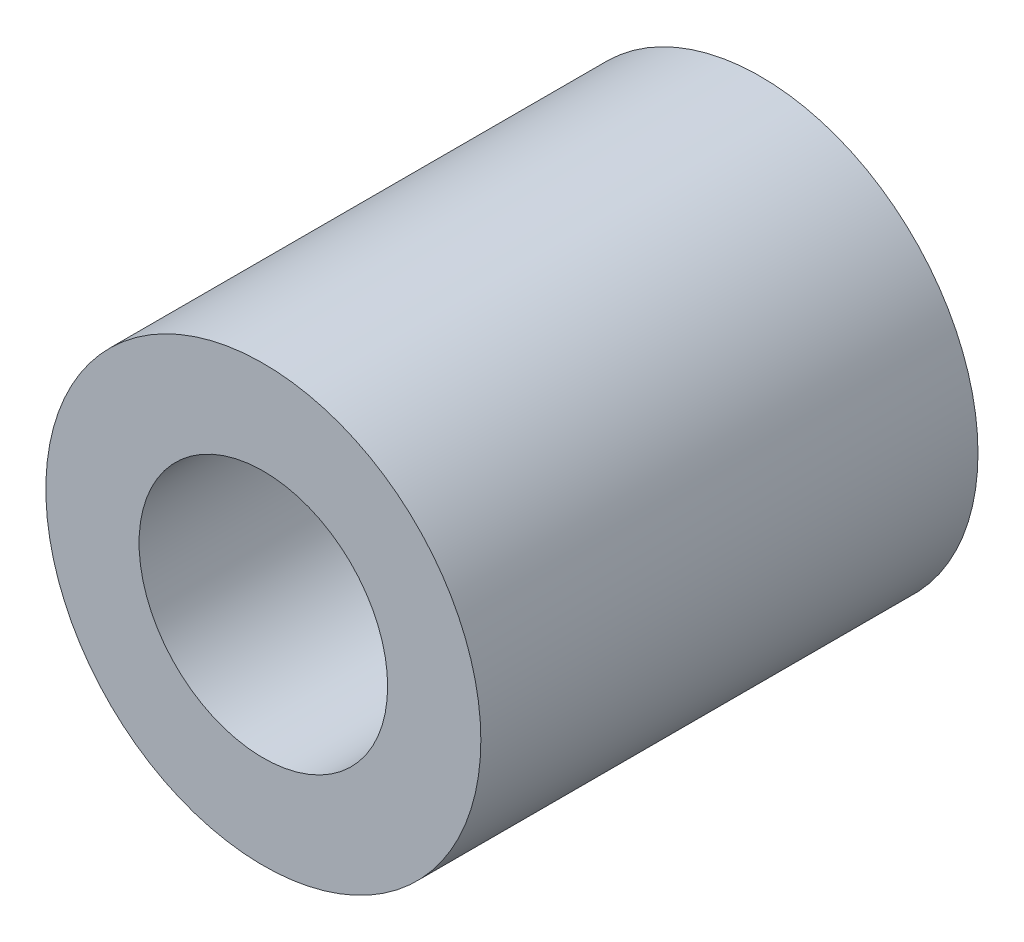
ISO-10303-21;
HEADER;
FILE_DESCRIPTION(('STEP AP214'),'2;1');
FILE_NAME('part.step','',(''),(''),'','','');
FILE_SCHEMA(('AUTOMOTIVE_DESIGN { 1 0 10303 214 1 1 1 1 }'));
ENDSEC;
DATA;
#1=APPLICATION_CONTEXT('core data for automotive mechanical design processes');
#2=APPLICATION_PROTOCOL_DEFINITION('international standard','automotive_design',2000,#1);
#3=PRODUCT_CONTEXT('',#1,'mechanical');
#4=PRODUCT('Part','Part','',(#3));
#5=PRODUCT_RELATED_PRODUCT_CATEGORY('part','',(#4));
#6=PRODUCT_DEFINITION_FORMATION('','',#4);
#7=PRODUCT_DEFINITION_CONTEXT('part definition',#1,'design');
#8=PRODUCT_DEFINITION('design','',#6,#7);
#9=PRODUCT_DEFINITION_SHAPE('','',#8);
#10=(LENGTH_UNIT() NAMED_UNIT(*) SI_UNIT(.MILLI.,.METRE.));
#11=(NAMED_UNIT(*) PLANE_ANGLE_UNIT() SI_UNIT($,.RADIAN.));
#12=(NAMED_UNIT(*) SI_UNIT($,.STERADIAN.) SOLID_ANGLE_UNIT());
#13=UNCERTAINTY_MEASURE_WITH_UNIT(LENGTH_MEASURE(1.E-05),#10,'distance_accuracy_value','');
#14=(GEOMETRIC_REPRESENTATION_CONTEXT(3) GLOBAL_UNCERTAINTY_ASSIGNED_CONTEXT((#13)) GLOBAL_UNIT_ASSIGNED_CONTEXT((#10,
#11,#12)) REPRESENTATION_CONTEXT('',''));
#15=CARTESIAN_POINT('',(0.,0.,0.));
#16=DIRECTION('',(0.,0.,1.));
#17=DIRECTION('',(1.,0.,0.));
#18=AXIS2_PLACEMENT_3D('',#15,#16,#17);
#19=CARTESIAN_POINT('',(3.88578058618805E-13,0.,12.7));
#20=DIRECTION('',(0.,0.,1.));
#21=DIRECTION('',(1.,0.,0.));
#22=AXIS2_PLACEMENT_3D('',#19,#20,#21);
#23=PLANE('',#22);
#24=CARTESIAN_POINT('',(3.88578058618805E-13,0.,12.7));
#25=DIRECTION('',(0.,0.,1.));
#26=DIRECTION('',(1.,0.,0.));
#27=AXIS2_PLACEMENT_3D('',#24,#25,#26);
#28=CIRCLE('',#27,11.1125);
#29=CARTESIAN_POINT('',(11.1125000000004,0.,12.7));
#30=VERTEX_POINT('',#29);
#31=EDGE_CURVE('E10',#30,#30,#28,.T.);
#32=ORIENTED_EDGE('',*,*,#31,.T.);
#33=EDGE_LOOP('',(#32));
#34=FACE_BOUND('',#33,.T.);
#35=CARTESIAN_POINT('',(3.88578058618805E-13,0.,12.7));
#36=DIRECTION('',(0.,0.,1.));
#37=DIRECTION('',(1.,0.,0.));
#38=AXIS2_PLACEMENT_3D('',#35,#36,#37);
#39=CIRCLE('',#38,6.35);
#40=CARTESIAN_POINT('',(6.35000000000039,0.,12.7));
#41=VERTEX_POINT('',#40);
#42=EDGE_CURVE('E39',#41,#41,#39,.T.);
#43=ORIENTED_EDGE('',*,*,#42,.F.);
#44=EDGE_LOOP('',(#43));
#45=FACE_BOUND('',#44,.T.);
#46=ADVANCED_FACE('F28',(#34,#45),#23,.T.);
#47=CARTESIAN_POINT('',(3.88578058618805E-13,0.,-12.7));
#48=DIRECTION('',(0.,0.,1.));
#49=DIRECTION('',(1.,0.,0.));
#50=AXIS2_PLACEMENT_3D('',#47,#48,#49);
#51=PLANE('',#50);
#52=CARTESIAN_POINT('',(3.88578058618805E-13,0.,-12.7));
#53=DIRECTION('',(0.,0.,1.));
#54=DIRECTION('',(1.,0.,0.));
#55=AXIS2_PLACEMENT_3D('',#52,#53,#54);
#56=CIRCLE('',#55,11.1125);
#57=CARTESIAN_POINT('',(11.1125000000004,0.,-12.7));
#58=VERTEX_POINT('',#57);
#59=EDGE_CURVE('E32',#58,#58,#56,.T.);
#60=ORIENTED_EDGE('',*,*,#59,.F.);
#61=EDGE_LOOP('',(#60));
#62=FACE_BOUND('',#61,.T.);
#63=CARTESIAN_POINT('',(3.88578058618805E-13,0.,-12.7));
#64=DIRECTION('',(0.,0.,1.));
#65=DIRECTION('',(1.,0.,0.));
#66=AXIS2_PLACEMENT_3D('',#63,#64,#65);
#67=CIRCLE('',#66,6.35);
#68=CARTESIAN_POINT('',(6.35000000000039,0.,-12.7));
#69=VERTEX_POINT('',#68);
#70=EDGE_CURVE('E41',#69,#69,#67,.T.);
#71=ORIENTED_EDGE('',*,*,#70,.T.);
#72=EDGE_LOOP('',(#71));
#73=FACE_BOUND('',#72,.T.);
#74=ADVANCED_FACE('F51',(#62,#73),#51,.F.);
#75=CARTESIAN_POINT('',(3.88578058618805E-13,0.,12.7));
#76=DIRECTION('',(0.,0.,-1.));
#77=DIRECTION('',(-1.,0.,0.));
#78=AXIS2_PLACEMENT_3D('',#75,#76,#77);
#79=CYLINDRICAL_SURFACE('',#78,11.1125);
#80=ORIENTED_EDGE('',*,*,#31,.F.);
#81=EDGE_LOOP('',(#80));
#82=FACE_BOUND('',#81,.T.);
#83=ORIENTED_EDGE('',*,*,#59,.T.);
#84=EDGE_LOOP('',(#83));
#85=FACE_BOUND('',#84,.T.);
#86=ADVANCED_FACE('F30',(#82,#85),#79,.T.);
#87=CARTESIAN_POINT('',(3.88578058618805E-13,0.,12.7));
#88=DIRECTION('',(0.,0.,-1.));
#89=DIRECTION('',(-1.,0.,0.));
#90=AXIS2_PLACEMENT_3D('',#87,#88,#89);
#91=CYLINDRICAL_SURFACE('',#90,6.35);
#92=ORIENTED_EDGE('',*,*,#42,.T.);
#93=EDGE_LOOP('',(#92));
#94=FACE_BOUND('',#93,.T.);
#95=ORIENTED_EDGE('',*,*,#70,.F.);
#96=EDGE_LOOP('',(#95));
#97=FACE_BOUND('',#96,.T.);
#98=ADVANCED_FACE('F47',(#94,#97),#91,.F.);
#99=CLOSED_SHELL('',(#46,#74,#86,#98));
#100=MANIFOLD_SOLID_BREP('B2',#99);
#101=ADVANCED_BREP_SHAPE_REPRESENTATION('',(#18,#100),#14);
#102=SHAPE_DEFINITION_REPRESENTATION(#9,#101);
ENDSEC;
END-ISO-10303-21;
